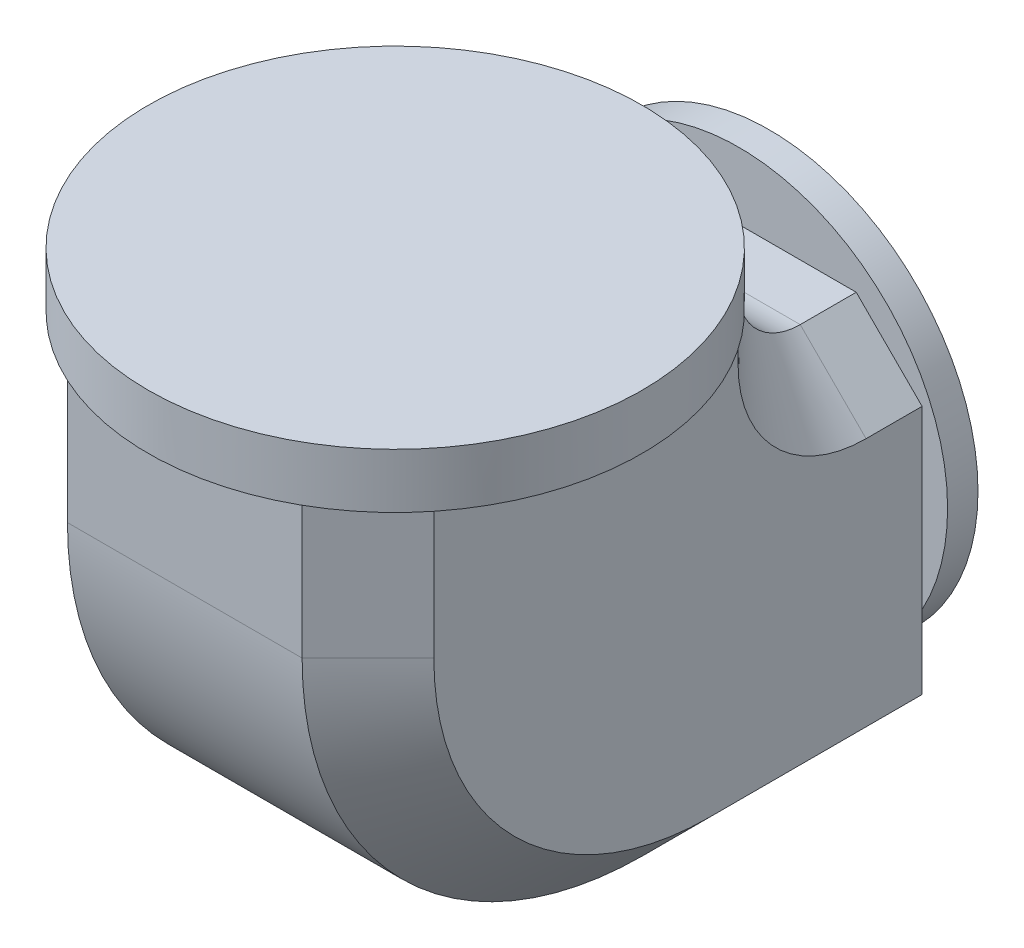
ISO-10303-21;
HEADER;
FILE_DESCRIPTION(('STEP AP214'),'2;1');
FILE_NAME('part.step','',(''),(''),'','','');
FILE_SCHEMA(('AUTOMOTIVE_DESIGN { 1 0 10303 214 1 1 1 1 }'));
ENDSEC;
DATA;
#1=APPLICATION_CONTEXT('core data for automotive mechanical design processes');
#2=APPLICATION_PROTOCOL_DEFINITION('international standard','automotive_design',2000,#1);
#3=PRODUCT_CONTEXT('',#1,'mechanical');
#4=PRODUCT('Part','Part','',(#3));
#5=PRODUCT_RELATED_PRODUCT_CATEGORY('part','',(#4));
#6=PRODUCT_DEFINITION_FORMATION('','',#4);
#7=PRODUCT_DEFINITION_CONTEXT('part definition',#1,'design');
#8=PRODUCT_DEFINITION('design','',#6,#7);
#9=PRODUCT_DEFINITION_SHAPE('','',#8);
#10=(LENGTH_UNIT() NAMED_UNIT(*) SI_UNIT(.MILLI.,.METRE.));
#11=(NAMED_UNIT(*) PLANE_ANGLE_UNIT() SI_UNIT($,.RADIAN.));
#12=(NAMED_UNIT(*) SI_UNIT($,.STERADIAN.) SOLID_ANGLE_UNIT());
#13=UNCERTAINTY_MEASURE_WITH_UNIT(LENGTH_MEASURE(1.E-05),#10,'distance_accuracy_value','');
#14=(GEOMETRIC_REPRESENTATION_CONTEXT(3) GLOBAL_UNCERTAINTY_ASSIGNED_CONTEXT((#13)) GLOBAL_UNIT_ASSIGNED_CONTEXT((#10,
#11,#12)) REPRESENTATION_CONTEXT('',''));
#15=CARTESIAN_POINT('',(0.,0.,0.));
#16=DIRECTION('',(0.,0.,1.));
#17=DIRECTION('',(1.,0.,0.));
#18=AXIS2_PLACEMENT_3D('',#15,#16,#17);
#19=CARTESIAN_POINT('',(3.88589279175839,25.6507770167076,3.1506045570211));
#20=DIRECTION('',(0.,-1.,0.));
#21=DIRECTION('',(0.,0.,-1.));
#22=AXIS2_PLACEMENT_3D('',#19,#20,#21);
#23=PLANE('',#22);
#24=CARTESIAN_POINT('',(0.,25.6507770167076,7.93488250373605));
#25=DIRECTION('',(0.,1.,0.));
#26=DIRECTION('',(0.,0.,1.));
#27=AXIS2_PLACEMENT_3D('',#24,#25,#26);
#28=CIRCLE('',#27,5.23823452244506);
#29=CARTESIAN_POINT('',(2.93316706671578,25.6507770167076,3.59487883197849));
#30=VERTEX_POINT('',#29);
#31=CARTESIAN_POINT('',(2.13302260670442,25.6507770167076,3.1506045570211));
#32=VERTEX_POINT('',#31);
#33=EDGE_CURVE('E263',#30,#32,#28,.T.);
#34=ORIENTED_EDGE('',*,*,#33,.F.);
#35=DIRECTION('',(0.707106781186549,0.,0.707106781186546));
#36=VECTOR('',#35,1.);
#37=CARTESIAN_POINT('',(3.88589279175839,25.6507770167076,4.54760455702109));
#38=LINE('',#37,#36);
#39=CARTESIAN_POINT('',(2.48889279175839,25.6507770167076,3.1506045570211));
#40=VERTEX_POINT('',#39);
#41=EDGE_CURVE('E277',#30,#40,#38,.F.);
#42=ORIENTED_EDGE('',*,*,#41,.T.);
#43=DIRECTION('',(-1.,0.,0.));
#44=VECTOR('',#43,1.);
#45=CARTESIAN_POINT('',(3.88589279175839,25.6507770167076,3.1506045570211));
#46=LINE('',#45,#44);
#47=EDGE_CURVE('E247',#40,#32,#46,.T.);
#48=ORIENTED_EDGE('',*,*,#47,.T.);
#49=EDGE_LOOP('',(#34,#42,#48));
#50=FACE_BOUND('',#49,.T.);
#51=ADVANCED_FACE('F30',(#50),#23,.F.);
#52=CARTESIAN_POINT('',(-2.13302260670442,25.6507770167076,3.1506045570211));
#53=VERTEX_POINT('',#52);
#54=CARTESIAN_POINT('',(-2.48889279175839,25.6507770167076,3.1506045570211));
#55=VERTEX_POINT('',#54);
#56=EDGE_CURVE('E349',#53,#55,#46,.T.);
#57=ORIENTED_EDGE('',*,*,#56,.T.);
#58=DIRECTION('',(-0.707106781186546,0.,0.707106781186549));
#59=VECTOR('',#58,1.);
#60=CARTESIAN_POINT('',(-2.48889279175839,25.6507770167076,3.1506045570211));
#61=LINE('',#60,#59);
#62=CARTESIAN_POINT('',(-2.93316706671578,25.6507770167076,3.59487883197849));
#63=VERTEX_POINT('',#62);
#64=EDGE_CURVE('E212',#55,#63,#61,.T.);
#65=ORIENTED_EDGE('',*,*,#64,.T.);
#66=EDGE_CURVE('E361',#53,#63,#28,.T.);
#67=ORIENTED_EDGE('',*,*,#66,.F.);
#68=EDGE_LOOP('',(#57,#65,#67));
#69=FACE_BOUND('',#68,.T.);
#70=ADVANCED_FACE('F360',(#69),#23,.F.);
#71=CARTESIAN_POINT('',(0.,20.5853515785748,0.64465823531532));
#72=DIRECTION('',(0.,0.,1.));
#73=DIRECTION('',(1.,0.,0.));
#74=AXIS2_PLACEMENT_3D('',#71,#72,#73);
#75=PLANE('',#74);
#76=CARTESIAN_POINT('',(0.,20.5853515785748,0.64465823531532));
#77=DIRECTION('',(0.,0.,1.));
#78=DIRECTION('',(1.,0.,0.));
#79=AXIS2_PLACEMENT_3D('',#76,#77,#78);
#80=CIRCLE('',#79,4.42713988409296);
#81=CARTESIAN_POINT('',(3.88589279175839,18.464171538058,0.64465823531532));
#82=VERTEX_POINT('',#81);
#83=CARTESIAN_POINT('',(-3.88589279175839,18.464171538058,0.64465823531532));
#84=VERTEX_POINT('',#83);
#85=EDGE_CURVE('E257',#82,#84,#80,.T.);
#86=ORIENTED_EDGE('',*,*,#85,.T.);
#87=DIRECTION('',(0.,1.,0.));
#88=VECTOR('',#87,1.);
#89=CARTESIAN_POINT('',(-3.88589279175839,15.5050201051597,0.64465823531532));
#90=LINE('',#89,#88);
#91=CARTESIAN_POINT('',(-3.88589279175839,22.1961172696127,0.64465823531532));
#92=VERTEX_POINT('',#91);
#93=EDGE_CURVE('E251',#84,#92,#90,.T.);
#94=ORIENTED_EDGE('',*,*,#93,.T.);
#95=DIRECTION('',(0.707106781186547,0.707106781186548,0.));
#96=VECTOR('',#95,1.);
#97=CARTESIAN_POINT('',(-2.48889279175839,23.5931172696127,0.64465823531532));
#98=LINE('',#97,#96);
#99=CARTESIAN_POINT('',(-2.48889279175839,23.5931172696127,0.64465823531532));
#100=VERTEX_POINT('',#99);
#101=EDGE_CURVE('E146',#92,#100,#98,.T.);
#102=ORIENTED_EDGE('',*,*,#101,.T.);
#103=DIRECTION('',(-1.,0.,0.));
#104=VECTOR('',#103,1.);
#105=CARTESIAN_POINT('',(3.88589279175839,23.5931172696127,0.64465823531532));
#106=LINE('',#105,#104);
#107=CARTESIAN_POINT('',(2.48889279175839,23.5931172696127,0.64465823531532));
#108=VERTEX_POINT('',#107);
#109=EDGE_CURVE('E236',#108,#100,#106,.T.);
#110=ORIENTED_EDGE('',*,*,#109,.F.);
#111=DIRECTION('',(-0.707106781186549,0.707106781186546,0.));
#112=VECTOR('',#111,1.);
#113=CARTESIAN_POINT('',(3.88589279175839,22.1961172696127,0.64465823531532));
#114=LINE('',#113,#112);
#115=CARTESIAN_POINT('',(3.88589279175839,22.1961172696127,0.64465823531532));
#116=VERTEX_POINT('',#115);
#117=EDGE_CURVE('E137',#108,#116,#114,.F.);
#118=ORIENTED_EDGE('',*,*,#117,.T.);
#119=DIRECTION('',(0.,1.,0.));
#120=VECTOR('',#119,1.);
#121=CARTESIAN_POINT('',(3.88589279175839,15.5050201051597,0.64465823531532));
#122=LINE('',#121,#120);
#123=EDGE_CURVE('E252',#82,#116,#122,.T.);
#124=ORIENTED_EDGE('',*,*,#123,.F.);
#125=EDGE_LOOP('',(#86,#94,#102,#110,#118,#124));
#126=FACE_BOUND('',#125,.T.);
#127=ADVANCED_FACE('F385',(#126),#75,.T.);
#128=CARTESIAN_POINT('',(0.,20.5853515785748,0.64465823531532));
#129=DIRECTION('',(0.,0.,-1.));
#130=DIRECTION('',(-1.,0.,0.));
#131=AXIS2_PLACEMENT_3D('',#128,#129,#130);
#132=CYLINDRICAL_SURFACE('',#131,4.42713988409296);
#133=ORIENTED_EDGE('',*,*,#85,.F.);
#134=EDGE_CURVE('E254',#84,#82,#80,.T.);
#135=ORIENTED_EDGE('',*,*,#134,.F.);
#136=EDGE_LOOP('',(#133,#135));
#137=FACE_BOUND('',#136,.T.);
#138=CARTESIAN_POINT('',(0.,20.5853515785748,0.));
#139=DIRECTION('',(0.,0.,1.));
#140=DIRECTION('',(1.,0.,0.));
#141=AXIS2_PLACEMENT_3D('',#138,#139,#140);
#142=CIRCLE('',#141,4.42713988409296);
#143=CARTESIAN_POINT('',(4.42713988409296,20.5853515785748,0.));
#144=VERTEX_POINT('',#143);
#145=EDGE_CURVE('E245',#144,#144,#142,.T.);
#146=ORIENTED_EDGE('',*,*,#145,.T.);
#147=EDGE_LOOP('',(#146));
#148=FACE_BOUND('',#147,.T.);
#149=ADVANCED_FACE('F436',(#137,#148),#132,.T.);
#150=CARTESIAN_POINT('',(0.,20.5853515785748,0.));
#151=DIRECTION('',(0.,0.,1.));
#152=DIRECTION('',(1.,0.,0.));
#153=AXIS2_PLACEMENT_3D('',#150,#151,#152);
#154=PLANE('',#153);
#155=ORIENTED_EDGE('',*,*,#145,.F.);
#156=EDGE_LOOP('',(#155));
#157=FACE_BOUND('',#156,.T.);
#158=ADVANCED_FACE('F431',(#157),#154,.F.);
#159=CARTESIAN_POINT('',(3.88589279175839,15.5050201051597,0.64465823531532));
#160=DIRECTION('',(0.,0.,1.));
#161=DIRECTION('',(1.,0.,0.));
#162=AXIS2_PLACEMENT_3D('',#159,#160,#161);
#163=PLANE('',#162);
#164=CARTESIAN_POINT('',(3.88589279175839,16.9020201051597,0.64465823531532));
#165=VERTEX_POINT('',#164);
#166=EDGE_CURVE('E306',#165,#82,#122,.T.);
#167=ORIENTED_EDGE('',*,*,#166,.F.);
#168=DIRECTION('',(0.70710678118655,0.707106781186545,0.));
#169=VECTOR('',#168,1.);
#170=CARTESIAN_POINT('',(3.88589279175839,16.9020201051597,0.64465823531532));
#171=LINE('',#170,#169);
#172=CARTESIAN_POINT('',(2.48889279175838,15.5050201051597,0.64465823531532));
#173=VERTEX_POINT('',#172);
#174=EDGE_CURVE('E298',#165,#173,#171,.F.);
#175=ORIENTED_EDGE('',*,*,#174,.T.);
#176=DIRECTION('',(-1.,0.,0.));
#177=VECTOR('',#176,1.);
#178=CARTESIAN_POINT('',(3.88589279175839,15.5050201051597,0.64465823531532));
#179=LINE('',#178,#177);
#180=CARTESIAN_POINT('',(-2.48889279175839,15.5050201051597,0.64465823531532));
#181=VERTEX_POINT('',#180);
#182=EDGE_CURVE('E107',#173,#181,#179,.T.);
#183=ORIENTED_EDGE('',*,*,#182,.T.);
#184=DIRECTION('',(-0.707106781186546,0.707106781186549,0.));
#185=VECTOR('',#184,1.);
#186=CARTESIAN_POINT('',(-2.48889279175839,15.5050201051597,0.64465823531532));
#187=LINE('',#186,#185);
#188=CARTESIAN_POINT('',(-3.88589279175839,16.9020201051597,0.64465823531532));
#189=VERTEX_POINT('',#188);
#190=EDGE_CURVE('E296',#181,#189,#187,.T.);
#191=ORIENTED_EDGE('',*,*,#190,.T.);
#192=EDGE_CURVE('E343',#189,#84,#90,.T.);
#193=ORIENTED_EDGE('',*,*,#192,.T.);
#194=ORIENTED_EDGE('',*,*,#134,.T.);
#195=EDGE_LOOP('',(#167,#175,#183,#191,#193,#194));
#196=FACE_BOUND('',#195,.T.);
#197=ADVANCED_FACE('F302',(#196),#163,.F.);
#198=CARTESIAN_POINT('',(3.88589279175839,15.5050201051597,5.15362318808235));
#199=DIRECTION('',(0.,1.,0.));
#200=DIRECTION('',(0.,0.,1.));
#201=AXIS2_PLACEMENT_3D('',#198,#199,#200);
#202=PLANE('',#201);
#203=ORIENTED_EDGE('',*,*,#182,.F.);
#204=DIRECTION('',(0.,0.,1.));
#205=VECTOR('',#204,1.);
#206=CARTESIAN_POINT('',(2.48889279175838,15.5050201051597,5.15362318808235));
#207=LINE('',#206,#205);
#208=CARTESIAN_POINT('',(2.48889279175838,15.5050201051597,5.15362318808235));
#209=VERTEX_POINT('',#208);
#210=EDGE_CURVE('E101',#173,#209,#207,.T.);
#211=ORIENTED_EDGE('',*,*,#210,.T.);
#212=DIRECTION('',(-1.,0.,0.));
#213=VECTOR('',#212,1.);
#214=CARTESIAN_POINT('',(3.88589279175839,15.5050201051597,5.15362318808235));
#215=LINE('',#214,#213);
#216=CARTESIAN_POINT('',(-2.48889279175839,15.5050201051597,5.15362318808235));
#217=VERTEX_POINT('',#216);
#218=EDGE_CURVE('E104',#209,#217,#215,.T.);
#219=ORIENTED_EDGE('',*,*,#218,.T.);
#220=DIRECTION('',(0.,0.,-1.));
#221=VECTOR('',#220,1.);
#222=CARTESIAN_POINT('',(-2.48889279175839,15.5050201051597,0.64465823531532));
#223=LINE('',#222,#221);
#224=EDGE_CURVE('E112',#217,#181,#223,.T.);
#225=ORIENTED_EDGE('',*,*,#224,.T.);
#226=EDGE_LOOP('',(#203,#211,#219,#225));
#227=FACE_BOUND('',#226,.T.);
#228=ADVANCED_FACE('F103',(#227),#202,.F.);
#229=CARTESIAN_POINT('',(3.88589279175839,23.5931172696127,0.64465823531532));
#230=DIRECTION('',(0.,-1.,0.));
#231=DIRECTION('',(0.,0.,-1.));
#232=AXIS2_PLACEMENT_3D('',#229,#230,#231);
#233=PLANE('',#232);
#234=DIRECTION('',(-1.,0.,0.));
#235=VECTOR('',#234,1.);
#236=CARTESIAN_POINT('',(3.88589279175839,23.5931172696127,1.83288711603069));
#237=LINE('',#236,#235);
#238=CARTESIAN_POINT('',(2.48889279175839,23.5931172696127,1.83288711603069));
#239=VERTEX_POINT('',#238);
#240=CARTESIAN_POINT('',(-2.48889279175839,23.5931172696127,1.83288711603069));
#241=VERTEX_POINT('',#240);
#242=EDGE_CURVE('E233',#239,#241,#237,.T.);
#243=ORIENTED_EDGE('',*,*,#242,.F.);
#244=DIRECTION('',(0.,0.,-1.));
#245=VECTOR('',#244,1.);
#246=CARTESIAN_POINT('',(2.48889279175839,23.5931172696127,0.64465823531532));
#247=LINE('',#246,#245);
#248=EDGE_CURVE('E237',#239,#108,#247,.T.);
#249=ORIENTED_EDGE('',*,*,#248,.T.);
#250=ORIENTED_EDGE('',*,*,#109,.T.);
#251=DIRECTION('',(0.,0.,1.));
#252=VECTOR('',#251,1.);
#253=CARTESIAN_POINT('',(-2.48889279175839,23.5931172696127,1.83288711603069));
#254=LINE('',#253,#252);
#255=EDGE_CURVE('E231',#100,#241,#254,.T.);
#256=ORIENTED_EDGE('',*,*,#255,.T.);
#257=EDGE_LOOP('',(#243,#249,#250,#256));
#258=FACE_BOUND('',#257,.T.);
#259=ADVANCED_FACE('F232',(#258),#233,.F.);
#260=CARTESIAN_POINT('',(3.88589279175839,24.9108347106031,1.83288711603069));
#261=DIRECTION('',(-1.,0.,0.));
#262=DIRECTION('',(0.,0.,1.));
#263=AXIS2_PLACEMENT_3D('',#260,#261,#262);
#264=CYLINDRICAL_SURFACE('',#263,1.31771744099041);
#265=DIRECTION('',(-1.,0.,0.));
#266=VECTOR('',#265,1.);
#267=CARTESIAN_POINT('',(3.88589279175839,24.9108347106031,3.1506045570211));
#268=LINE('',#267,#266);
#269=CARTESIAN_POINT('',(2.48889279175839,24.9108347106031,3.1506045570211));
#270=VERTEX_POINT('',#269);
#271=CARTESIAN_POINT('',(-2.48889279175839,24.9108347106031,3.1506045570211));
#272=VERTEX_POINT('',#271);
#273=EDGE_CURVE('E243',#270,#272,#268,.T.);
#274=ORIENTED_EDGE('',*,*,#273,.F.);
#275=CARTESIAN_POINT('',(2.48889279175839,24.9108347106031,1.83288711603069));
#276=DIRECTION('',(-1.,0.,0.));
#277=DIRECTION('',(0.,0.,1.));
#278=AXIS2_PLACEMENT_3D('',#275,#276,#277);
#279=CIRCLE('',#278,1.31771744099041);
#280=EDGE_CURVE('E225',#270,#239,#279,.F.);
#281=ORIENTED_EDGE('',*,*,#280,.T.);
#282=ORIENTED_EDGE('',*,*,#242,.T.);
#283=CARTESIAN_POINT('',(-2.48889279175839,24.9108347106031,1.83288711603069));
#284=DIRECTION('',(-1.,0.,0.));
#285=DIRECTION('',(0.,0.,1.));
#286=AXIS2_PLACEMENT_3D('',#283,#284,#285);
#287=CIRCLE('',#286,1.31771744099041);
#288=EDGE_CURVE('E216',#241,#272,#287,.T.);
#289=ORIENTED_EDGE('',*,*,#288,.T.);
#290=EDGE_LOOP('',(#274,#281,#282,#289));
#291=FACE_BOUND('',#290,.T.);
#292=ADVANCED_FACE('F241',(#291),#264,.F.);
#293=CARTESIAN_POINT('',(3.88589279175839,24.9108347106031,3.1506045570211));
#294=DIRECTION('',(0.,0.,1.));
#295=DIRECTION('',(1.,0.,0.));
#296=AXIS2_PLACEMENT_3D('',#293,#294,#295);
#297=PLANE('',#296);
#298=ORIENTED_EDGE('',*,*,#47,.F.);
#299=DIRECTION('',(0.,-1.,0.));
#300=VECTOR('',#299,1.);
#301=CARTESIAN_POINT('',(2.48889279175839,24.9108347106031,3.1506045570211));
#302=LINE('',#301,#300);
#303=EDGE_CURVE('E226',#40,#270,#302,.T.);
#304=ORIENTED_EDGE('',*,*,#303,.T.);
#305=ORIENTED_EDGE('',*,*,#273,.T.);
#306=DIRECTION('',(0.,1.,0.));
#307=VECTOR('',#306,1.);
#308=CARTESIAN_POINT('',(-2.48889279175839,25.6507770167076,3.1506045570211));
#309=LINE('',#308,#307);
#310=EDGE_CURVE('E280',#272,#55,#309,.T.);
#311=ORIENTED_EDGE('',*,*,#310,.T.);
#312=ORIENTED_EDGE('',*,*,#56,.F.);
#313=EDGE_CURVE('E352',#32,#53,#46,.T.);
#314=ORIENTED_EDGE('',*,*,#313,.F.);
#315=EDGE_LOOP('',(#298,#304,#305,#311,#312,#314));
#316=FACE_BOUND('',#315,.T.);
#317=ADVANCED_FACE('F367',(#316),#297,.F.);
#318=CARTESIAN_POINT('',(3.88589279175839,25.6507770167076,12.3984235755756));
#319=DIRECTION('',(0.,0.,-1.));
#320=DIRECTION('',(-1.,0.,0.));
#321=AXIS2_PLACEMENT_3D('',#318,#319,#320);
#322=PLANE('',#321);
#323=DIRECTION('',(-1.,0.,0.));
#324=VECTOR('',#323,1.);
#325=CARTESIAN_POINT('',(3.88589279175839,22.749820492653,12.3984235755756));
#326=LINE('',#325,#324);
#327=CARTESIAN_POINT('',(2.48889279175838,22.749820492653,12.3984235755756));
#328=VERTEX_POINT('',#327);
#329=CARTESIAN_POINT('',(-2.48889279175839,22.749820492653,12.3984235755756));
#330=VERTEX_POINT('',#329);
#331=EDGE_CURVE('E119',#328,#330,#326,.T.);
#332=ORIENTED_EDGE('',*,*,#331,.F.);
#333=DIRECTION('',(0.,1.,0.));
#334=VECTOR('',#333,1.);
#335=CARTESIAN_POINT('',(2.48889279175838,25.6507770167076,12.3984235755756));
#336=LINE('',#335,#334);
#337=CARTESIAN_POINT('',(2.48889279175838,25.6507770167076,12.3984235755756));
#338=VERTEX_POINT('',#337);
#339=EDGE_CURVE('E76',#328,#338,#336,.T.);
#340=ORIENTED_EDGE('',*,*,#339,.T.);
#341=DIRECTION('',(-1.,0.,0.));
#342=VECTOR('',#341,1.);
#343=CARTESIAN_POINT('',(3.88589279175839,25.6507770167076,12.3984235755756));
#344=LINE('',#343,#342);
#345=CARTESIAN_POINT('',(-2.48889279175839,25.6507770167076,12.3984235755756));
#346=VERTEX_POINT('',#345);
#347=EDGE_CURVE('E347',#338,#346,#344,.T.);
#348=ORIENTED_EDGE('',*,*,#347,.T.);
#349=DIRECTION('',(0.,-1.,0.));
#350=VECTOR('',#349,1.);
#351=CARTESIAN_POINT('',(-2.48889279175839,22.749820492653,12.3984235755756));
#352=LINE('',#351,#350);
#353=EDGE_CURVE('E293',#346,#330,#352,.T.);
#354=ORIENTED_EDGE('',*,*,#353,.T.);
#355=EDGE_LOOP('',(#332,#340,#348,#354));
#356=FACE_BOUND('',#355,.T.);
#357=ADVANCED_FACE('F346',(#356),#322,.F.);
#358=CARTESIAN_POINT('',(3.88589279175839,22.749820492653,5.15362318808235));
#359=DIRECTION('',(-1.,0.,0.));
#360=DIRECTION('',(0.,0.,1.));
#361=AXIS2_PLACEMENT_3D('',#358,#359,#360);
#362=CYLINDRICAL_SURFACE('',#361,7.24480038749328);
#363=ORIENTED_EDGE('',*,*,#218,.F.);
#364=CARTESIAN_POINT('',(2.48889279175838,22.749820492653,5.15362318808235));
#365=DIRECTION('',(-1.,0.,0.));
#366=DIRECTION('',(0.,0.,1.));
#367=AXIS2_PLACEMENT_3D('',#364,#365,#366);
#368=CIRCLE('',#367,7.24480038749328);
#369=EDGE_CURVE('E118',#209,#328,#368,.T.);
#370=ORIENTED_EDGE('',*,*,#369,.T.);
#371=ORIENTED_EDGE('',*,*,#331,.T.);
#372=CARTESIAN_POINT('',(-2.48889279175839,22.749820492653,5.15362318808235));
#373=DIRECTION('',(-1.,0.,0.));
#374=DIRECTION('',(0.,0.,1.));
#375=AXIS2_PLACEMENT_3D('',#372,#373,#374);
#376=CIRCLE('',#375,7.24480038749328);
#377=EDGE_CURVE('E111',#330,#217,#376,.F.);
#378=ORIENTED_EDGE('',*,*,#377,.T.);
#379=EDGE_LOOP('',(#363,#370,#371,#378));
#380=FACE_BOUND('',#379,.T.);
#381=ADVANCED_FACE('F115',(#380),#362,.T.);
#382=CARTESIAN_POINT('',(3.88589279175839,24.9108347106031,1.83288711603069));
#383=DIRECTION('',(-1.,0.,0.));
#384=DIRECTION('',(0.,0.,1.));
#385=AXIS2_PLACEMENT_3D('',#382,#383,#384);
#386=PLANE('',#385);
#387=ORIENTED_EDGE('',*,*,#123,.T.);
#388=DIRECTION('',(0.,0.,1.));
#389=VECTOR('',#388,1.);
#390=CARTESIAN_POINT('',(3.88589279175839,22.1961172696127,1.83288711603069));
#391=LINE('',#390,#389);
#392=CARTESIAN_POINT('',(3.88589279175839,22.1961172696127,1.83288711603069));
#393=VERTEX_POINT('',#392);
#394=EDGE_CURVE('E238',#116,#393,#391,.T.);
#395=ORIENTED_EDGE('',*,*,#394,.T.);
#396=CARTESIAN_POINT('',(3.88589279175839,24.9108347106031,1.83288711603069));
#397=DIRECTION('',(-1.,0.,0.));
#398=DIRECTION('',(0.,0.,1.));
#399=AXIS2_PLACEMENT_3D('',#396,#397,#398);
#400=CIRCLE('',#399,2.71471744099041);
#401=CARTESIAN_POINT('',(3.88589279175839,24.9108347106031,4.5476045570211));
#402=VERTEX_POINT('',#401);
#403=EDGE_CURVE('E268',#393,#402,#400,.T.);
#404=ORIENTED_EDGE('',*,*,#403,.T.);
#405=DIRECTION('',(0.,1.,0.));
#406=VECTOR('',#405,1.);
#407=CARTESIAN_POINT('',(3.88589279175839,24.9108347106031,4.54760455702109));
#408=LINE('',#407,#406);
#409=CARTESIAN_POINT('',(3.88589279175839,25.6507770167076,4.54760455702109));
#410=VERTEX_POINT('',#409);
#411=EDGE_CURVE('E271',#402,#410,#408,.T.);
#412=ORIENTED_EDGE('',*,*,#411,.T.);
#413=DIRECTION('',(0.,0.,1.));
#414=VECTOR('',#413,1.);
#415=CARTESIAN_POINT('',(3.88589279175839,25.6507770167076,3.1506045570211));
#416=LINE('',#415,#414);
#417=CARTESIAN_POINT('',(3.88589279175839,25.6507770167076,11.0014235755756));
#418=VERTEX_POINT('',#417);
#419=EDGE_CURVE('E120',#410,#418,#416,.T.);
#420=ORIENTED_EDGE('',*,*,#419,.T.);
#421=DIRECTION('',(0.,-1.,0.));
#422=VECTOR('',#421,1.);
#423=CARTESIAN_POINT('',(3.88589279175839,24.9108347106031,11.0014235755756));
#424=LINE('',#423,#422);
#425=CARTESIAN_POINT('',(3.88589279175839,22.749820492653,11.0014235755756));
#426=VERTEX_POINT('',#425);
#427=EDGE_CURVE('E265',#418,#426,#424,.T.);
#428=ORIENTED_EDGE('',*,*,#427,.T.);
#429=CARTESIAN_POINT('',(3.88589279175839,22.749820492653,5.15362318808235));
#430=DIRECTION('',(-1.,0.,0.));
#431=DIRECTION('',(0.,0.,1.));
#432=AXIS2_PLACEMENT_3D('',#429,#430,#431);
#433=CIRCLE('',#432,5.84780038749328);
#434=CARTESIAN_POINT('',(3.88589279175839,16.9020201051597,5.15362318808235));
#435=VERTEX_POINT('',#434);
#436=EDGE_CURVE('E260',#426,#435,#433,.F.);
#437=ORIENTED_EDGE('',*,*,#436,.T.);
#438=DIRECTION('',(0.,0.,-1.));
#439=VECTOR('',#438,1.);
#440=CARTESIAN_POINT('',(3.88589279175839,16.9020201051597,1.83288711603069));
#441=LINE('',#440,#439);
#442=EDGE_CURVE('E128',#435,#165,#441,.T.);
#443=ORIENTED_EDGE('',*,*,#442,.T.);
#444=ORIENTED_EDGE('',*,*,#166,.T.);
#445=EDGE_LOOP('',(#387,#395,#404,#412,#420,#428,#437,#443,#444));
#446=FACE_BOUND('',#445,.T.);
#447=ADVANCED_FACE('F403',(#446),#386,.F.);
#448=CARTESIAN_POINT('',(-3.88589279175839,24.9108347106031,1.83288711603069));
#449=DIRECTION('',(-1.,0.,0.));
#450=DIRECTION('',(0.,0.,1.));
#451=AXIS2_PLACEMENT_3D('',#448,#449,#450);
#452=PLANE('',#451);
#453=CARTESIAN_POINT('',(-3.88589279175839,24.9108347106031,1.83288711603069));
#454=DIRECTION('',(-1.,0.,0.));
#455=DIRECTION('',(0.,0.,1.));
#456=AXIS2_PLACEMENT_3D('',#453,#454,#455);
#457=CIRCLE('',#456,2.71471744099041);
#458=CARTESIAN_POINT('',(-3.88589279175839,24.9108347106031,4.5476045570211));
#459=VERTEX_POINT('',#458);
#460=CARTESIAN_POINT('',(-3.88589279175839,22.1961172696127,1.83288711603069));
#461=VERTEX_POINT('',#460);
#462=EDGE_CURVE('E193',#459,#461,#457,.F.);
#463=ORIENTED_EDGE('',*,*,#462,.T.);
#464=DIRECTION('',(0.,0.,-1.));
#465=VECTOR('',#464,1.);
#466=CARTESIAN_POINT('',(-3.88589279175839,22.1961172696127,0.64465823531532));
#467=LINE('',#466,#465);
#468=EDGE_CURVE('E197',#461,#92,#467,.T.);
#469=ORIENTED_EDGE('',*,*,#468,.T.);
#470=ORIENTED_EDGE('',*,*,#93,.F.);
#471=ORIENTED_EDGE('',*,*,#192,.F.);
#472=DIRECTION('',(0.,0.,1.));
#473=VECTOR('',#472,1.);
#474=CARTESIAN_POINT('',(-3.88589279175839,16.9020201051597,5.15362318808235));
#475=LINE('',#474,#473);
#476=CARTESIAN_POINT('',(-3.88589279175839,16.9020201051597,5.15362318808235));
#477=VERTEX_POINT('',#476);
#478=EDGE_CURVE('E179',#189,#477,#475,.T.);
#479=ORIENTED_EDGE('',*,*,#478,.T.);
#480=CARTESIAN_POINT('',(-3.88589279175839,22.749820492653,5.15362318808235));
#481=DIRECTION('',(-1.,0.,0.));
#482=DIRECTION('',(0.,0.,1.));
#483=AXIS2_PLACEMENT_3D('',#480,#481,#482);
#484=CIRCLE('',#483,5.84780038749328);
#485=CARTESIAN_POINT('',(-3.88589279175839,22.749820492653,11.0014235755756));
#486=VERTEX_POINT('',#485);
#487=EDGE_CURVE('E174',#477,#486,#484,.T.);
#488=ORIENTED_EDGE('',*,*,#487,.T.);
#489=DIRECTION('',(0.,1.,0.));
#490=VECTOR('',#489,1.);
#491=CARTESIAN_POINT('',(-3.88589279175839,25.6507770167076,11.0014235755756));
#492=LINE('',#491,#490);
#493=CARTESIAN_POINT('',(-3.88589279175839,25.6507770167076,11.0014235755756));
#494=VERTEX_POINT('',#493);
#495=EDGE_CURVE('E205',#486,#494,#492,.T.);
#496=ORIENTED_EDGE('',*,*,#495,.T.);
#497=DIRECTION('',(0.,0.,1.));
#498=VECTOR('',#497,1.);
#499=CARTESIAN_POINT('',(-3.88589279175839,25.6507770167076,3.1506045570211));
#500=LINE('',#499,#498);
#501=CARTESIAN_POINT('',(-3.88589279175839,25.6507770167076,4.5476045570211));
#502=VERTEX_POINT('',#501);
#503=EDGE_CURVE('E340',#502,#494,#500,.T.);
#504=ORIENTED_EDGE('',*,*,#503,.F.);
#505=DIRECTION('',(0.,-1.,0.));
#506=VECTOR('',#505,1.);
#507=CARTESIAN_POINT('',(-3.88589279175839,24.9108347106031,4.5476045570211));
#508=LINE('',#507,#506);
#509=EDGE_CURVE('E201',#502,#459,#508,.T.);
#510=ORIENTED_EDGE('',*,*,#509,.T.);
#511=EDGE_LOOP('',(#463,#469,#470,#471,#479,#488,#496,#504,#510));
#512=FACE_BOUND('',#511,.T.);
#513=ADVANCED_FACE('F195',(#512),#452,.T.);
#514=CARTESIAN_POINT('',(0.,25.6507770167076,7.93488250373605));
#515=DIRECTION('',(0.,1.,0.));
#516=DIRECTION('',(0.,0.,1.));
#517=AXIS2_PLACEMENT_3D('',#514,#515,#516);
#518=PLANE('',#517);
#519=EDGE_CURVE('E49',#63,#30,#28,.T.);
#520=ORIENTED_EDGE('',*,*,#519,.F.);
#521=DIRECTION('',(-0.707106781186546,0.,0.707106781186549));
#522=VECTOR('',#521,1.);
#523=CARTESIAN_POINT('',(-3.63658536923668,25.6507770167076,4.29829713449939));
#524=LINE('',#523,#522);
#525=EDGE_CURVE('E149',#63,#502,#524,.T.);
#526=ORIENTED_EDGE('',*,*,#525,.T.);
#527=ORIENTED_EDGE('',*,*,#503,.T.);
#528=DIRECTION('',(0.707106781186546,0.,0.707106781186549));
#529=VECTOR('',#528,1.);
#530=CARTESIAN_POINT('',(-3.47621693179899,25.6507770167076,11.411099435535));
#531=LINE('',#530,#529);
#532=EDGE_CURVE('E11',#494,#346,#531,.T.);
#533=ORIENTED_EDGE('',*,*,#532,.T.);
#534=ORIENTED_EDGE('',*,*,#347,.F.);
#535=DIRECTION('',(-0.707106781186549,0.,0.707106781186546));
#536=VECTOR('',#535,1.);
#537=CARTESIAN_POINT('',(3.47621693179898,25.6507770167076,11.411099435535));
#538=LINE('',#537,#536);
#539=EDGE_CURVE('E40',#338,#418,#538,.F.);
#540=ORIENTED_EDGE('',*,*,#539,.T.);
#541=ORIENTED_EDGE('',*,*,#419,.F.);
#542=DIRECTION('',(0.707106781186549,0.,0.707106781186546));
#543=VECTOR('',#542,1.);
#544=CARTESIAN_POINT('',(3.63658536923666,25.6507770167076,4.29829713449937));
#545=LINE('',#544,#543);
#546=EDGE_CURVE('E140',#410,#30,#545,.F.);
#547=ORIENTED_EDGE('',*,*,#546,.T.);
#548=EDGE_LOOP('',(#520,#526,#527,#533,#534,#540,#541,#547));
#549=FACE_BOUND('',#548,.T.);
#550=ADVANCED_FACE('F342',(#549),#518,.F.);
#551=EDGE_CURVE('E161',#32,#53,#28,.T.);
#552=ORIENTED_EDGE('',*,*,#551,.F.);
#553=ORIENTED_EDGE('',*,*,#313,.T.);
#554=EDGE_LOOP('',(#552,#553));
#555=FACE_BOUND('',#554,.T.);
#556=ADVANCED_FACE('F542',(#555),#518,.F.);
#557=CARTESIAN_POINT('',(0.,26.812043823768,7.93488250373605));
#558=DIRECTION('',(0.,-1.,0.));
#559=DIRECTION('',(0.,0.,-1.));
#560=AXIS2_PLACEMENT_3D('',#557,#558,#559);
#561=CYLINDRICAL_SURFACE('',#560,5.23823452244506);
#562=CARTESIAN_POINT('',(0.,26.812043823768,7.93488250373605));
#563=DIRECTION('',(0.,1.,0.));
#564=DIRECTION('',(0.,0.,1.));
#565=AXIS2_PLACEMENT_3D('',#562,#563,#564);
#566=CIRCLE('',#565,5.23823452244506);
#567=CARTESIAN_POINT('',(0.,26.812043823768,13.1731170261811));
#568=VERTEX_POINT('',#567);
#569=EDGE_CURVE('E393',#568,#568,#566,.T.);
#570=ORIENTED_EDGE('',*,*,#569,.F.);
#571=EDGE_LOOP('',(#570));
#572=FACE_BOUND('',#571,.T.);
#573=ORIENTED_EDGE('',*,*,#66,.T.);
#574=ORIENTED_EDGE('',*,*,#519,.T.);
#575=ORIENTED_EDGE('',*,*,#33,.T.);
#576=ORIENTED_EDGE('',*,*,#551,.T.);
#577=EDGE_LOOP('',(#573,#574,#575,#576));
#578=FACE_BOUND('',#577,.T.);
#579=ADVANCED_FACE('F534',(#572,#578),#561,.T.);
#580=CARTESIAN_POINT('',(0.,26.812043823768,7.93488250373605));
#581=DIRECTION('',(0.,1.,0.));
#582=DIRECTION('',(0.,0.,1.));
#583=AXIS2_PLACEMENT_3D('',#580,#581,#582);
#584=PLANE('',#583);
#585=ORIENTED_EDGE('',*,*,#569,.T.);
#586=EDGE_LOOP('',(#585));
#587=FACE_BOUND('',#586,.T.);
#588=ADVANCED_FACE('F449',(#587),#584,.T.);
#589=CARTESIAN_POINT('',(3.88589279175839,24.9108347106031,4.54760455702109));
#590=DIRECTION('',(-0.707106781186546,0.,0.707106781186549));
#591=DIRECTION('',(0.707106781186549,0.,0.707106781186546));
#592=AXIS2_PLACEMENT_3D('',#589,#590,#591);
#593=PLANE('',#592);
#594=ORIENTED_EDGE('',*,*,#546,.F.);
#595=ORIENTED_EDGE('',*,*,#411,.F.);
#596=DIRECTION('',(0.707106781186549,0.,0.707106781186546));
#597=VECTOR('',#596,1.);
#598=CARTESIAN_POINT('',(2.48889279175839,24.9108347106031,3.1506045570211));
#599=LINE('',#598,#597);
#600=EDGE_CURVE('E157',#270,#402,#599,.T.);
#601=ORIENTED_EDGE('',*,*,#600,.F.);
#602=ORIENTED_EDGE('',*,*,#303,.F.);
#603=ORIENTED_EDGE('',*,*,#41,.F.);
#604=EDGE_LOOP('',(#594,#595,#601,#602,#603));
#605=FACE_BOUND('',#604,.T.);
#606=ADVANCED_FACE('F373',(#605),#593,.F.);
#607=CARTESIAN_POINT('',(3.88589279175839,24.9108347106031,1.83288711603069));
#608=DIRECTION('',(1.,0.,0.));
#609=DIRECTION('',(0.,0.,-1.));
#610=AXIS2_PLACEMENT_3D('',#607,#608,#609);
#611=CONICAL_SURFACE('',#610,2.71471744099041,0.785398163397447);
#612=ORIENTED_EDGE('',*,*,#600,.T.);
#613=ORIENTED_EDGE('',*,*,#403,.F.);
#614=DIRECTION('',(0.707106781186549,-0.707106781186546,0.));
#615=VECTOR('',#614,1.);
#616=CARTESIAN_POINT('',(2.48889279175839,23.5931172696127,1.83288711603069));
#617=LINE('',#616,#615);
#618=EDGE_CURVE('E154',#239,#393,#617,.T.);
#619=ORIENTED_EDGE('',*,*,#618,.F.);
#620=ORIENTED_EDGE('',*,*,#280,.F.);
#621=EDGE_LOOP('',(#612,#613,#619,#620));
#622=FACE_BOUND('',#621,.T.);
#623=ADVANCED_FACE('F378',(#622),#611,.F.);
#624=CARTESIAN_POINT('',(3.88589279175839,22.1961172696127,1.83288711603069));
#625=DIRECTION('',(-0.707106781186546,-0.707106781186549,0.));
#626=DIRECTION('',(0.707106781186549,-0.707106781186546,0.));
#627=AXIS2_PLACEMENT_3D('',#624,#625,#626);
#628=PLANE('',#627);
#629=ORIENTED_EDGE('',*,*,#117,.F.);
#630=ORIENTED_EDGE('',*,*,#248,.F.);
#631=ORIENTED_EDGE('',*,*,#618,.T.);
#632=ORIENTED_EDGE('',*,*,#394,.F.);
#633=EDGE_LOOP('',(#629,#630,#631,#632));
#634=FACE_BOUND('',#633,.T.);
#635=ADVANCED_FACE('F382',(#634),#628,.F.);
#636=CARTESIAN_POINT('',(-2.48889279175839,24.9108347106031,3.1506045570211));
#637=DIRECTION('',(-0.707106781186549,0.,-0.707106781186546));
#638=DIRECTION('',(-0.707106781186546,0.,0.707106781186549));
#639=AXIS2_PLACEMENT_3D('',#636,#637,#638);
#640=PLANE('',#639);
#641=ORIENTED_EDGE('',*,*,#64,.F.);
#642=ORIENTED_EDGE('',*,*,#310,.F.);
#643=DIRECTION('',(0.707106781186546,0.,-0.707106781186549));
#644=VECTOR('',#643,1.);
#645=CARTESIAN_POINT('',(-3.88589279175839,24.9108347106031,4.5476045570211));
#646=LINE('',#645,#644);
#647=EDGE_CURVE('E158',#459,#272,#646,.T.);
#648=ORIENTED_EDGE('',*,*,#647,.F.);
#649=ORIENTED_EDGE('',*,*,#509,.F.);
#650=ORIENTED_EDGE('',*,*,#525,.F.);
#651=EDGE_LOOP('',(#641,#642,#648,#649,#650));
#652=FACE_BOUND('',#651,.T.);
#653=ADVANCED_FACE('F366',(#652),#640,.T.);
#654=CARTESIAN_POINT('',(-2.48889279175839,24.9108347106031,1.83288711603069));
#655=DIRECTION('',(-1.,0.,0.));
#656=DIRECTION('',(0.,0.,1.));
#657=AXIS2_PLACEMENT_3D('',#654,#655,#656);
#658=CONICAL_SURFACE('',#657,1.31771744099041,0.78539816339745);
#659=ORIENTED_EDGE('',*,*,#647,.T.);
#660=ORIENTED_EDGE('',*,*,#288,.F.);
#661=DIRECTION('',(0.707106781186547,0.707106781186548,0.));
#662=VECTOR('',#661,1.);
#663=CARTESIAN_POINT('',(-3.88589279175839,22.1961172696127,1.83288711603069));
#664=LINE('',#663,#662);
#665=EDGE_CURVE('E131',#461,#241,#664,.T.);
#666=ORIENTED_EDGE('',*,*,#665,.F.);
#667=ORIENTED_EDGE('',*,*,#462,.F.);
#668=EDGE_LOOP('',(#659,#660,#666,#667));
#669=FACE_BOUND('',#668,.T.);
#670=ADVANCED_FACE('F214',(#669),#658,.F.);
#671=CARTESIAN_POINT('',(-2.48889279175839,23.5931172696127,0.64465823531532));
#672=DIRECTION('',(-0.707106781186548,0.707106781186547,0.));
#673=DIRECTION('',(-0.707106781186547,-0.707106781186548,0.));
#674=AXIS2_PLACEMENT_3D('',#671,#672,#673);
#675=PLANE('',#674);
#676=ORIENTED_EDGE('',*,*,#101,.F.);
#677=ORIENTED_EDGE('',*,*,#468,.F.);
#678=ORIENTED_EDGE('',*,*,#665,.T.);
#679=ORIENTED_EDGE('',*,*,#255,.F.);
#680=EDGE_LOOP('',(#676,#677,#678,#679));
#681=FACE_BOUND('',#680,.T.);
#682=ADVANCED_FACE('F209',(#681),#675,.T.);
#683=CARTESIAN_POINT('',(3.88589279175839,16.9020201051597,1.83288711603069));
#684=DIRECTION('',(-0.707106781186545,0.70710678118655,0.));
#685=DIRECTION('',(-0.70710678118655,-0.707106781186545,0.));
#686=AXIS2_PLACEMENT_3D('',#683,#684,#685);
#687=PLANE('',#686);
#688=ORIENTED_EDGE('',*,*,#174,.F.);
#689=ORIENTED_EDGE('',*,*,#442,.F.);
#690=DIRECTION('',(0.70710678118655,0.707106781186545,0.));
#691=VECTOR('',#690,1.);
#692=CARTESIAN_POINT('',(2.48889279175838,15.5050201051597,5.15362318808235));
#693=LINE('',#692,#691);
#694=EDGE_CURVE('E124',#209,#435,#693,.T.);
#695=ORIENTED_EDGE('',*,*,#694,.F.);
#696=ORIENTED_EDGE('',*,*,#210,.F.);
#697=EDGE_LOOP('',(#688,#689,#695,#696));
#698=FACE_BOUND('',#697,.T.);
#699=ADVANCED_FACE('F125',(#698),#687,.F.);
#700=CARTESIAN_POINT('',(3.88589279175839,22.749820492653,5.15362318808235));
#701=DIRECTION('',(-1.,0.,0.));
#702=DIRECTION('',(0.,0.,1.));
#703=AXIS2_PLACEMENT_3D('',#700,#701,#702);
#704=CONICAL_SURFACE('',#703,5.84780038749328,0.785398163397446);
#705=ORIENTED_EDGE('',*,*,#694,.T.);
#706=ORIENTED_EDGE('',*,*,#436,.F.);
#707=DIRECTION('',(0.707106781186549,0.,-0.707106781186546));
#708=VECTOR('',#707,1.);
#709=CARTESIAN_POINT('',(2.48889279175838,22.749820492653,12.3984235755756));
#710=LINE('',#709,#708);
#711=EDGE_CURVE('E132',#328,#426,#710,.T.);
#712=ORIENTED_EDGE('',*,*,#711,.F.);
#713=ORIENTED_EDGE('',*,*,#369,.F.);
#714=EDGE_LOOP('',(#705,#706,#712,#713));
#715=FACE_BOUND('',#714,.T.);
#716=ADVANCED_FACE('F135',(#715),#704,.T.);
#717=CARTESIAN_POINT('',(3.88589279175839,24.9108347106031,11.0014235755756));
#718=DIRECTION('',(-0.707106781186546,0.,-0.707106781186549));
#719=DIRECTION('',(-0.707106781186549,0.,0.707106781186546));
#720=AXIS2_PLACEMENT_3D('',#717,#718,#719);
#721=PLANE('',#720);
#722=ORIENTED_EDGE('',*,*,#539,.F.);
#723=ORIENTED_EDGE('',*,*,#339,.F.);
#724=ORIENTED_EDGE('',*,*,#711,.T.);
#725=ORIENTED_EDGE('',*,*,#427,.F.);
#726=EDGE_LOOP('',(#722,#723,#724,#725));
#727=FACE_BOUND('',#726,.T.);
#728=ADVANCED_FACE('F406',(#727),#721,.F.);
#729=CARTESIAN_POINT('',(-2.48889279175839,15.5050201051597,5.15362318808235));
#730=DIRECTION('',(-0.707106781186549,-0.707106781186546,0.));
#731=DIRECTION('',(0.707106781186546,-0.707106781186549,0.));
#732=AXIS2_PLACEMENT_3D('',#729,#730,#731);
#733=PLANE('',#732);
#734=ORIENTED_EDGE('',*,*,#190,.F.);
#735=ORIENTED_EDGE('',*,*,#224,.F.);
#736=DIRECTION('',(0.707106781186546,-0.707106781186549,0.));
#737=VECTOR('',#736,1.);
#738=CARTESIAN_POINT('',(-3.88589279175839,16.9020201051597,5.15362318808235));
#739=LINE('',#738,#737);
#740=EDGE_CURVE('E34',#477,#217,#739,.T.);
#741=ORIENTED_EDGE('',*,*,#740,.F.);
#742=ORIENTED_EDGE('',*,*,#478,.F.);
#743=EDGE_LOOP('',(#734,#735,#741,#742));
#744=FACE_BOUND('',#743,.T.);
#745=ADVANCED_FACE('F32',(#744),#733,.T.);
#746=CARTESIAN_POINT('',(-2.48889279175839,22.749820492653,5.15362318808235));
#747=DIRECTION('',(1.,0.,0.));
#748=DIRECTION('',(0.,0.,-1.));
#749=AXIS2_PLACEMENT_3D('',#746,#747,#748);
#750=CONICAL_SURFACE('',#749,7.24480038749328,0.78539816339745);
#751=ORIENTED_EDGE('',*,*,#740,.T.);
#752=ORIENTED_EDGE('',*,*,#377,.F.);
#753=DIRECTION('',(0.707106781186547,0.,0.707106781186548));
#754=VECTOR('',#753,1.);
#755=CARTESIAN_POINT('',(-3.88589279175839,22.749820492653,11.0014235755756));
#756=LINE('',#755,#754);
#757=EDGE_CURVE('E86',#486,#330,#756,.T.);
#758=ORIENTED_EDGE('',*,*,#757,.F.);
#759=ORIENTED_EDGE('',*,*,#487,.F.);
#760=EDGE_LOOP('',(#751,#752,#758,#759));
#761=FACE_BOUND('',#760,.T.);
#762=ADVANCED_FACE('F170',(#761),#750,.T.);
#763=CARTESIAN_POINT('',(-2.48889279175839,25.6507770167076,12.3984235755756));
#764=DIRECTION('',(-0.707106781186549,0.,0.707106781186546));
#765=DIRECTION('',(0.707106781186546,0.,0.707106781186549));
#766=AXIS2_PLACEMENT_3D('',#763,#764,#765);
#767=PLANE('',#766);
#768=ORIENTED_EDGE('',*,*,#532,.F.);
#769=ORIENTED_EDGE('',*,*,#495,.F.);
#770=ORIENTED_EDGE('',*,*,#757,.T.);
#771=ORIENTED_EDGE('',*,*,#353,.F.);
#772=EDGE_LOOP('',(#768,#769,#770,#771));
#773=FACE_BOUND('',#772,.T.);
#774=ADVANCED_FACE('F345',(#773),#767,.T.);
#775=CLOSED_SHELL('',(#51,#70,#127,#149,#158,#197,#228,#259,#292,#317,#357,#381,#447,#513,#550,
#556,#579,#588,#606,#623,#635,#653,#670,#682,#699,#716,#728,#745,#762,#774));
#776=MANIFOLD_SOLID_BREP('B2',#775);
#777=ADVANCED_BREP_SHAPE_REPRESENTATION('',(#18,#776),#14);
#778=SHAPE_DEFINITION_REPRESENTATION(#9,#777);
ENDSEC;
END-ISO-10303-21;
